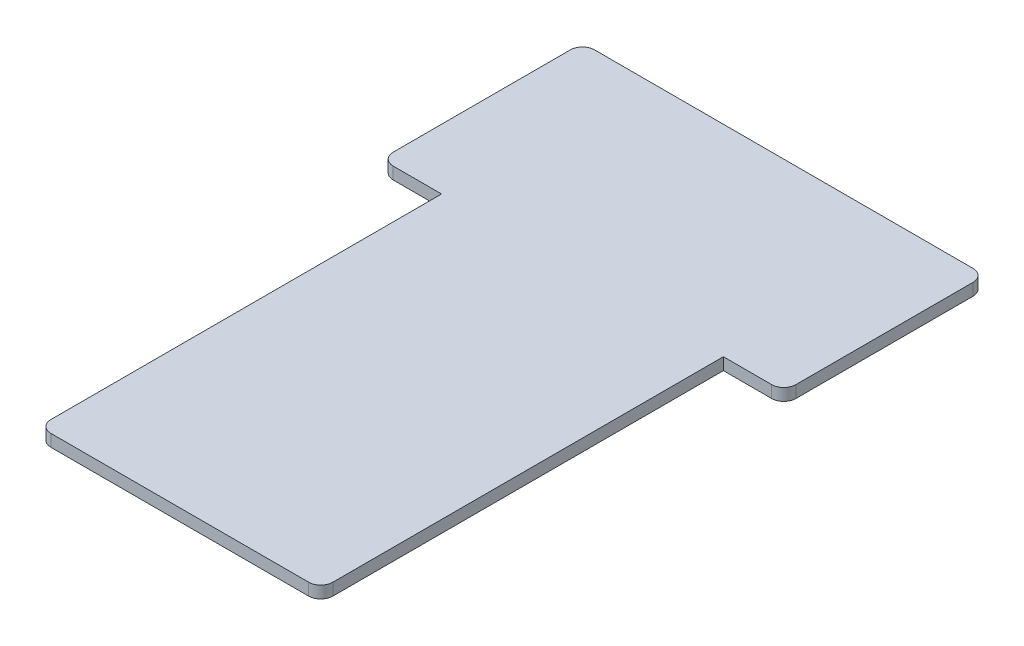
ISO-10303-21;
HEADER;
FILE_DESCRIPTION(('STEP AP214'),'2;1');
FILE_NAME('part.step','',(''),(''),'','','');
FILE_SCHEMA(('AUTOMOTIVE_DESIGN { 1 0 10303 214 1 1 1 1 }'));
ENDSEC;
DATA;
#1=APPLICATION_CONTEXT('core data for automotive mechanical design processes');
#2=APPLICATION_PROTOCOL_DEFINITION('international standard','automotive_design',2000,#1);
#3=PRODUCT_CONTEXT('',#1,'mechanical');
#4=PRODUCT('Part','Part','',(#3));
#5=PRODUCT_RELATED_PRODUCT_CATEGORY('part','',(#4));
#6=PRODUCT_DEFINITION_FORMATION('','',#4);
#7=PRODUCT_DEFINITION_CONTEXT('part definition',#1,'design');
#8=PRODUCT_DEFINITION('design','',#6,#7);
#9=PRODUCT_DEFINITION_SHAPE('','',#8);
#10=(LENGTH_UNIT() NAMED_UNIT(*) SI_UNIT(.MILLI.,.METRE.));
#11=(NAMED_UNIT(*) PLANE_ANGLE_UNIT() SI_UNIT($,.RADIAN.));
#12=(NAMED_UNIT(*) SI_UNIT($,.STERADIAN.) SOLID_ANGLE_UNIT());
#13=UNCERTAINTY_MEASURE_WITH_UNIT(LENGTH_MEASURE(1.E-05),#10,'distance_accuracy_value','');
#14=(GEOMETRIC_REPRESENTATION_CONTEXT(3) GLOBAL_UNCERTAINTY_ASSIGNED_CONTEXT((#13)) GLOBAL_UNIT_ASSIGNED_CONTEXT((#10,
#11,#12)) REPRESENTATION_CONTEXT('',''));
#15=CARTESIAN_POINT('',(0.,0.,0.));
#16=DIRECTION('',(0.,0.,1.));
#17=DIRECTION('',(1.,0.,0.));
#18=AXIS2_PLACEMENT_3D('',#15,#16,#17);
#19=CARTESIAN_POINT('',(-50.,3.,75.));
#20=DIRECTION('',(1.,0.,0.));
#21=DIRECTION('',(0.,0.,-1.));
#22=AXIS2_PLACEMENT_3D('',#19,#20,#21);
#23=PLANE('',#22);
#24=DIRECTION('',(0.,0.,1.));
#25=VECTOR('',#24,1.);
#26=CARTESIAN_POINT('',(-50.,0.,75.));
#27=LINE('',#26,#25);
#28=CARTESIAN_POINT('',(-50.,0.,-72.));
#29=VERTEX_POINT('',#28);
#30=CARTESIAN_POINT('',(-50.,0.,-28.));
#31=VERTEX_POINT('',#30);
#32=EDGE_CURVE('E207',#29,#31,#27,.T.);
#33=ORIENTED_EDGE('',*,*,#32,.T.);
#34=DIRECTION('',(0.,1.,0.));
#35=VECTOR('',#34,1.);
#36=CARTESIAN_POINT('',(-50.,3.,-28.));
#37=LINE('',#36,#35);
#38=CARTESIAN_POINT('',(-50.,3.,-28.));
#39=VERTEX_POINT('',#38);
#40=EDGE_CURVE('E48',#31,#39,#37,.T.);
#41=ORIENTED_EDGE('',*,*,#40,.T.);
#42=DIRECTION('',(0.,0.,1.));
#43=VECTOR('',#42,1.);
#44=CARTESIAN_POINT('',(-50.,3.,75.));
#45=LINE('',#44,#43);
#46=CARTESIAN_POINT('',(-50.,3.,-72.));
#47=VERTEX_POINT('',#46);
#48=EDGE_CURVE('E192',#47,#39,#45,.T.);
#49=ORIENTED_EDGE('',*,*,#48,.F.);
#50=DIRECTION('',(0.,-1.,0.));
#51=VECTOR('',#50,1.);
#52=CARTESIAN_POINT('',(-50.,3.,-72.));
#53=LINE('',#52,#51);
#54=EDGE_CURVE('E276',#47,#29,#53,.T.);
#55=ORIENTED_EDGE('',*,*,#54,.T.);
#56=EDGE_LOOP('',(#33,#41,#49,#55));
#57=FACE_BOUND('',#56,.T.);
#58=ADVANCED_FACE('F39',(#57),#23,.F.);
#59=CARTESIAN_POINT('',(-50.,3.,75.));
#60=DIRECTION('',(0.,0.,-1.));
#61=DIRECTION('',(-1.,0.,0.));
#62=AXIS2_PLACEMENT_3D('',#59,#60,#61);
#63=PLANE('',#62);
#64=DIRECTION('',(1.,0.,0.));
#65=VECTOR('',#64,1.);
#66=CARTESIAN_POINT('',(-50.,0.,75.));
#67=LINE('',#66,#65);
#68=CARTESIAN_POINT('',(-32.,0.,75.));
#69=VERTEX_POINT('',#68);
#70=CARTESIAN_POINT('',(32.,0.,75.));
#71=VERTEX_POINT('',#70);
#72=EDGE_CURVE('E188',#69,#71,#67,.T.);
#73=ORIENTED_EDGE('',*,*,#72,.T.);
#74=DIRECTION('',(0.,1.,0.));
#75=VECTOR('',#74,1.);
#76=CARTESIAN_POINT('',(32.,3.,75.));
#77=LINE('',#76,#75);
#78=CARTESIAN_POINT('',(32.,3.,75.));
#79=VERTEX_POINT('',#78);
#80=EDGE_CURVE('E216',#71,#79,#77,.T.);
#81=ORIENTED_EDGE('',*,*,#80,.T.);
#82=DIRECTION('',(1.,0.,0.));
#83=VECTOR('',#82,1.);
#84=CARTESIAN_POINT('',(-50.,3.,75.));
#85=LINE('',#84,#83);
#86=CARTESIAN_POINT('',(-32.,3.,75.));
#87=VERTEX_POINT('',#86);
#88=EDGE_CURVE('E196',#87,#79,#85,.T.);
#89=ORIENTED_EDGE('',*,*,#88,.F.);
#90=DIRECTION('',(0.,1.,0.));
#91=VECTOR('',#90,1.);
#92=CARTESIAN_POINT('',(-32.,3.,75.));
#93=LINE('',#92,#91);
#94=EDGE_CURVE('E200',#87,#69,#93,.F.);
#95=ORIENTED_EDGE('',*,*,#94,.T.);
#96=EDGE_LOOP('',(#73,#81,#89,#95));
#97=FACE_BOUND('',#96,.T.);
#98=ADVANCED_FACE('F315',(#97),#63,.F.);
#99=CARTESIAN_POINT('',(0.,3.,0.));
#100=DIRECTION('',(0.,-1.,0.));
#101=DIRECTION('',(0.,0.,-1.));
#102=AXIS2_PLACEMENT_3D('',#99,#100,#101);
#103=PLANE('',#102);
#104=ORIENTED_EDGE('',*,*,#88,.T.);
#105=CARTESIAN_POINT('',(32.,3.,72.));
#106=DIRECTION('',(0.,-1.,0.));
#107=DIRECTION('',(0.,0.,-1.));
#108=AXIS2_PLACEMENT_3D('',#105,#106,#107);
#109=CIRCLE('',#108,3.);
#110=CARTESIAN_POINT('',(35.,3.,72.));
#111=VERTEX_POINT('',#110);
#112=EDGE_CURVE('E235',#79,#111,#109,.F.);
#113=ORIENTED_EDGE('',*,*,#112,.T.);
#114=DIRECTION('',(0.,0.,1.));
#115=VECTOR('',#114,1.);
#116=CARTESIAN_POINT('',(35.,3.,0.));
#117=LINE('',#116,#115);
#118=CARTESIAN_POINT('',(35.,3.,-25.));
#119=VERTEX_POINT('',#118);
#120=EDGE_CURVE('E169',#119,#111,#117,.T.);
#121=ORIENTED_EDGE('',*,*,#120,.F.);
#122=DIRECTION('',(1.,0.,0.));
#123=VECTOR('',#122,1.);
#124=CARTESIAN_POINT('',(0.,3.,-25.));
#125=LINE('',#124,#123);
#126=CARTESIAN_POINT('',(47.,3.,-25.));
#127=VERTEX_POINT('',#126);
#128=EDGE_CURVE('E162',#119,#127,#125,.T.);
#129=ORIENTED_EDGE('',*,*,#128,.T.);
#130=CARTESIAN_POINT('',(47.,3.,-28.));
#131=DIRECTION('',(0.,-1.,0.));
#132=DIRECTION('',(0.,0.,-1.));
#133=AXIS2_PLACEMENT_3D('',#130,#131,#132);
#134=CIRCLE('',#133,3.);
#135=CARTESIAN_POINT('',(50.,3.,-28.));
#136=VERTEX_POINT('',#135);
#137=EDGE_CURVE('E229',#127,#136,#134,.F.);
#138=ORIENTED_EDGE('',*,*,#137,.T.);
#139=DIRECTION('',(0.,0.,-1.));
#140=VECTOR('',#139,1.);
#141=CARTESIAN_POINT('',(50.,3.,75.));
#142=LINE('',#141,#140);
#143=CARTESIAN_POINT('',(50.,3.,-72.));
#144=VERTEX_POINT('',#143);
#145=EDGE_CURVE('E183',#136,#144,#142,.T.);
#146=ORIENTED_EDGE('',*,*,#145,.T.);
#147=CARTESIAN_POINT('',(47.,3.,-72.));
#148=DIRECTION('',(0.,-1.,0.));
#149=DIRECTION('',(0.,0.,-1.));
#150=AXIS2_PLACEMENT_3D('',#147,#148,#149);
#151=CIRCLE('',#150,3.);
#152=CARTESIAN_POINT('',(47.,3.,-75.));
#153=VERTEX_POINT('',#152);
#154=EDGE_CURVE('E232',#144,#153,#151,.F.);
#155=ORIENTED_EDGE('',*,*,#154,.T.);
#156=DIRECTION('',(-1.,0.,0.));
#157=VECTOR('',#156,1.);
#158=CARTESIAN_POINT('',(-50.,3.,-75.));
#159=LINE('',#158,#157);
#160=CARTESIAN_POINT('',(-47.,3.,-75.));
#161=VERTEX_POINT('',#160);
#162=EDGE_CURVE('E187',#153,#161,#159,.T.);
#163=ORIENTED_EDGE('',*,*,#162,.T.);
#164=CARTESIAN_POINT('',(-47.,3.,-72.));
#165=DIRECTION('',(0.,-1.,0.));
#166=DIRECTION('',(0.,0.,-1.));
#167=AXIS2_PLACEMENT_3D('',#164,#165,#166);
#168=CIRCLE('',#167,3.);
#169=EDGE_CURVE('E220',#161,#47,#168,.F.);
#170=ORIENTED_EDGE('',*,*,#169,.T.);
#171=ORIENTED_EDGE('',*,*,#48,.T.);
#172=CARTESIAN_POINT('',(-47.,3.,-28.));
#173=DIRECTION('',(0.,-1.,0.));
#174=DIRECTION('',(0.,0.,-1.));
#175=AXIS2_PLACEMENT_3D('',#172,#173,#174);
#176=CIRCLE('',#175,3.);
#177=CARTESIAN_POINT('',(-47.,3.,-25.));
#178=VERTEX_POINT('',#177);
#179=EDGE_CURVE('E223',#39,#178,#176,.F.);
#180=ORIENTED_EDGE('',*,*,#179,.T.);
#181=DIRECTION('',(-1.,0.,0.));
#182=VECTOR('',#181,1.);
#183=CARTESIAN_POINT('',(0.,3.,-25.));
#184=LINE('',#183,#182);
#185=CARTESIAN_POINT('',(-35.,3.,-25.));
#186=VERTEX_POINT('',#185);
#187=EDGE_CURVE('E178',#186,#178,#184,.T.);
#188=ORIENTED_EDGE('',*,*,#187,.F.);
#189=DIRECTION('',(0.,0.,1.));
#190=VECTOR('',#189,1.);
#191=CARTESIAN_POINT('',(-35.,3.,0.));
#192=LINE('',#191,#190);
#193=CARTESIAN_POINT('',(-35.,3.,72.));
#194=VERTEX_POINT('',#193);
#195=EDGE_CURVE('E174',#186,#194,#192,.T.);
#196=ORIENTED_EDGE('',*,*,#195,.T.);
#197=CARTESIAN_POINT('',(-32.,3.,72.));
#198=DIRECTION('',(0.,-1.,0.));
#199=DIRECTION('',(0.,0.,-1.));
#200=AXIS2_PLACEMENT_3D('',#197,#198,#199);
#201=CIRCLE('',#200,3.);
#202=EDGE_CURVE('E226',#194,#87,#201,.F.);
#203=ORIENTED_EDGE('',*,*,#202,.T.);
#204=EDGE_LOOP('',(#104,#113,#121,#129,#138,#146,#155,#163,#170,#171,#180,#188,#196,#203));
#205=FACE_BOUND('',#204,.T.);
#206=ADVANCED_FACE('F289',(#205),#103,.F.);
#207=CARTESIAN_POINT('',(0.,0.,0.));
#208=DIRECTION('',(0.,-1.,0.));
#209=DIRECTION('',(0.,0.,-1.));
#210=AXIS2_PLACEMENT_3D('',#207,#208,#209);
#211=PLANE('',#210);
#212=DIRECTION('',(0.,0.,-1.));
#213=VECTOR('',#212,1.);
#214=CARTESIAN_POINT('',(35.,0.,75.));
#215=LINE('',#214,#213);
#216=CARTESIAN_POINT('',(35.,0.,72.));
#217=VERTEX_POINT('',#216);
#218=CARTESIAN_POINT('',(35.,0.,-25.));
#219=VERTEX_POINT('',#218);
#220=EDGE_CURVE('E141',#217,#219,#215,.T.);
#221=ORIENTED_EDGE('',*,*,#220,.F.);
#222=CARTESIAN_POINT('',(32.,0.,72.));
#223=DIRECTION('',(0.,-1.,0.));
#224=DIRECTION('',(0.,0.,-1.));
#225=AXIS2_PLACEMENT_3D('',#222,#223,#224);
#226=CIRCLE('',#225,3.);
#227=EDGE_CURVE('E253',#217,#71,#226,.T.);
#228=ORIENTED_EDGE('',*,*,#227,.T.);
#229=ORIENTED_EDGE('',*,*,#72,.F.);
#230=CARTESIAN_POINT('',(-32.,0.,72.));
#231=DIRECTION('',(0.,-1.,0.));
#232=DIRECTION('',(0.,0.,-1.));
#233=AXIS2_PLACEMENT_3D('',#230,#231,#232);
#234=CIRCLE('',#233,3.);
#235=CARTESIAN_POINT('',(-35.,0.,72.));
#236=VERTEX_POINT('',#235);
#237=EDGE_CURVE('E246',#69,#236,#234,.T.);
#238=ORIENTED_EDGE('',*,*,#237,.T.);
#239=DIRECTION('',(0.,0.,-1.));
#240=VECTOR('',#239,1.);
#241=CARTESIAN_POINT('',(-35.,0.,75.));
#242=LINE('',#241,#240);
#243=CARTESIAN_POINT('',(-35.,0.,-25.));
#244=VERTEX_POINT('',#243);
#245=EDGE_CURVE('E308',#236,#244,#242,.T.);
#246=ORIENTED_EDGE('',*,*,#245,.T.);
#247=DIRECTION('',(1.,0.,0.));
#248=VECTOR('',#247,1.);
#249=CARTESIAN_POINT('',(-50.,0.,-25.));
#250=LINE('',#249,#248);
#251=CARTESIAN_POINT('',(-47.,0.,-25.));
#252=VERTEX_POINT('',#251);
#253=EDGE_CURVE('E148',#252,#244,#250,.T.);
#254=ORIENTED_EDGE('',*,*,#253,.F.);
#255=CARTESIAN_POINT('',(-47.,0.,-28.));
#256=DIRECTION('',(0.,-1.,0.));
#257=DIRECTION('',(0.,0.,-1.));
#258=AXIS2_PLACEMENT_3D('',#255,#256,#257);
#259=CIRCLE('',#258,3.);
#260=EDGE_CURVE('E243',#252,#31,#259,.T.);
#261=ORIENTED_EDGE('',*,*,#260,.T.);
#262=ORIENTED_EDGE('',*,*,#32,.F.);
#263=CARTESIAN_POINT('',(-47.,0.,-72.));
#264=DIRECTION('',(0.,-1.,0.));
#265=DIRECTION('',(0.,0.,-1.));
#266=AXIS2_PLACEMENT_3D('',#263,#264,#265);
#267=CIRCLE('',#266,3.);
#268=CARTESIAN_POINT('',(-47.,0.,-75.));
#269=VERTEX_POINT('',#268);
#270=EDGE_CURVE('E240',#29,#269,#267,.T.);
#271=ORIENTED_EDGE('',*,*,#270,.T.);
#272=DIRECTION('',(-1.,0.,0.));
#273=VECTOR('',#272,1.);
#274=CARTESIAN_POINT('',(-50.,0.,-75.));
#275=LINE('',#274,#273);
#276=CARTESIAN_POINT('',(47.,0.,-75.));
#277=VERTEX_POINT('',#276);
#278=EDGE_CURVE('E203',#277,#269,#275,.T.);
#279=ORIENTED_EDGE('',*,*,#278,.F.);
#280=CARTESIAN_POINT('',(47.,0.,-72.));
#281=DIRECTION('',(0.,-1.,0.));
#282=DIRECTION('',(0.,0.,-1.));
#283=AXIS2_PLACEMENT_3D('',#280,#281,#282);
#284=CIRCLE('',#283,3.);
#285=CARTESIAN_POINT('',(50.,0.,-72.));
#286=VERTEX_POINT('',#285);
#287=EDGE_CURVE('E61',#277,#286,#284,.T.);
#288=ORIENTED_EDGE('',*,*,#287,.T.);
#289=DIRECTION('',(0.,0.,-1.));
#290=VECTOR('',#289,1.);
#291=CARTESIAN_POINT('',(50.,0.,75.));
#292=LINE('',#291,#290);
#293=CARTESIAN_POINT('',(50.,0.,-28.));
#294=VERTEX_POINT('',#293);
#295=EDGE_CURVE('E182',#294,#286,#292,.T.);
#296=ORIENTED_EDGE('',*,*,#295,.F.);
#297=CARTESIAN_POINT('',(47.,0.,-28.));
#298=DIRECTION('',(0.,-1.,0.));
#299=DIRECTION('',(0.,0.,-1.));
#300=AXIS2_PLACEMENT_3D('',#297,#298,#299);
#301=CIRCLE('',#300,3.);
#302=CARTESIAN_POINT('',(47.,0.,-25.));
#303=VERTEX_POINT('',#302);
#304=EDGE_CURVE('E55',#294,#303,#301,.T.);
#305=ORIENTED_EDGE('',*,*,#304,.T.);
#306=DIRECTION('',(-1.,0.,0.));
#307=VECTOR('',#306,1.);
#308=CARTESIAN_POINT('',(50.,0.,-25.));
#309=LINE('',#308,#307);
#310=EDGE_CURVE('E138',#303,#219,#309,.T.);
#311=ORIENTED_EDGE('',*,*,#310,.T.);
#312=EDGE_LOOP('',(#221,#228,#229,#238,#246,#254,#261,#262,#271,#279,#288,#296,#305,#311));
#313=FACE_BOUND('',#312,.T.);
#314=ADVANCED_FACE('F140',(#313),#211,.T.);
#315=CARTESIAN_POINT('',(50.,3.,75.));
#316=DIRECTION('',(-1.,0.,0.));
#317=DIRECTION('',(0.,0.,1.));
#318=AXIS2_PLACEMENT_3D('',#315,#316,#317);
#319=PLANE('',#318);
#320=ORIENTED_EDGE('',*,*,#295,.T.);
#321=DIRECTION('',(0.,-1.,0.));
#322=VECTOR('',#321,1.);
#323=CARTESIAN_POINT('',(50.,3.,-72.));
#324=LINE('',#323,#322);
#325=EDGE_CURVE('E266',#286,#144,#324,.F.);
#326=ORIENTED_EDGE('',*,*,#325,.T.);
#327=ORIENTED_EDGE('',*,*,#145,.F.);
#328=DIRECTION('',(0.,1.,0.));
#329=VECTOR('',#328,1.);
#330=CARTESIAN_POINT('',(50.,3.,-28.));
#331=LINE('',#330,#329);
#332=EDGE_CURVE('E263',#136,#294,#331,.F.);
#333=ORIENTED_EDGE('',*,*,#332,.T.);
#334=EDGE_LOOP('',(#320,#326,#327,#333));
#335=FACE_BOUND('',#334,.T.);
#336=ADVANCED_FACE('F324',(#335),#319,.F.);
#337=CARTESIAN_POINT('',(-50.,3.,-75.));
#338=DIRECTION('',(0.,0.,1.));
#339=DIRECTION('',(1.,0.,0.));
#340=AXIS2_PLACEMENT_3D('',#337,#338,#339);
#341=PLANE('',#340);
#342=ORIENTED_EDGE('',*,*,#162,.F.);
#343=DIRECTION('',(0.,-1.,0.));
#344=VECTOR('',#343,1.);
#345=CARTESIAN_POINT('',(47.,3.,-75.));
#346=LINE('',#345,#344);
#347=EDGE_CURVE('E259',#153,#277,#346,.T.);
#348=ORIENTED_EDGE('',*,*,#347,.T.);
#349=ORIENTED_EDGE('',*,*,#278,.T.);
#350=DIRECTION('',(0.,-1.,0.));
#351=VECTOR('',#350,1.);
#352=CARTESIAN_POINT('',(-47.,3.,-75.));
#353=LINE('',#352,#351);
#354=EDGE_CURVE('E256',#269,#161,#353,.F.);
#355=ORIENTED_EDGE('',*,*,#354,.T.);
#356=EDGE_LOOP('',(#342,#348,#349,#355));
#357=FACE_BOUND('',#356,.T.);
#358=ADVANCED_FACE('F345',(#357),#341,.F.);
#359=CARTESIAN_POINT('',(50.,0.,-25.));
#360=DIRECTION('',(0.,0.,-1.));
#361=DIRECTION('',(-1.,0.,0.));
#362=AXIS2_PLACEMENT_3D('',#359,#360,#361);
#363=PLANE('',#362);
#364=ORIENTED_EDGE('',*,*,#310,.F.);
#365=DIRECTION('',(0.,1.,0.));
#366=VECTOR('',#365,1.);
#367=CARTESIAN_POINT('',(47.,0.,-25.));
#368=LINE('',#367,#366);
#369=EDGE_CURVE('E269',#303,#127,#368,.T.);
#370=ORIENTED_EDGE('',*,*,#369,.T.);
#371=ORIENTED_EDGE('',*,*,#128,.F.);
#372=DIRECTION('',(0.,1.,0.));
#373=VECTOR('',#372,1.);
#374=CARTESIAN_POINT('',(35.,0.,-25.));
#375=LINE('',#374,#373);
#376=EDGE_CURVE('E154',#219,#119,#375,.T.);
#377=ORIENTED_EDGE('',*,*,#376,.F.);
#378=EDGE_LOOP('',(#364,#370,#371,#377));
#379=FACE_BOUND('',#378,.T.);
#380=ADVANCED_FACE('F160',(#379),#363,.F.);
#381=CARTESIAN_POINT('',(35.,0.,75.));
#382=DIRECTION('',(1.,0.,0.));
#383=DIRECTION('',(0.,0.,-1.));
#384=AXIS2_PLACEMENT_3D('',#381,#382,#383);
#385=PLANE('',#384);
#386=ORIENTED_EDGE('',*,*,#120,.T.);
#387=DIRECTION('',(0.,1.,0.));
#388=VECTOR('',#387,1.);
#389=CARTESIAN_POINT('',(35.,0.,72.));
#390=LINE('',#389,#388);
#391=EDGE_CURVE('E157',#111,#217,#390,.F.);
#392=ORIENTED_EDGE('',*,*,#391,.T.);
#393=ORIENTED_EDGE('',*,*,#220,.T.);
#394=ORIENTED_EDGE('',*,*,#376,.T.);
#395=EDGE_LOOP('',(#386,#392,#393,#394));
#396=FACE_BOUND('',#395,.T.);
#397=ADVANCED_FACE('F153',(#396),#385,.T.);
#398=CARTESIAN_POINT('',(-50.,0.,-25.));
#399=DIRECTION('',(0.,0.,1.));
#400=DIRECTION('',(1.,0.,0.));
#401=AXIS2_PLACEMENT_3D('',#398,#399,#400);
#402=PLANE('',#401);
#403=ORIENTED_EDGE('',*,*,#187,.T.);
#404=DIRECTION('',(0.,1.,0.));
#405=VECTOR('',#404,1.);
#406=CARTESIAN_POINT('',(-47.,0.,-25.));
#407=LINE('',#406,#405);
#408=EDGE_CURVE('E11',#178,#252,#407,.F.);
#409=ORIENTED_EDGE('',*,*,#408,.T.);
#410=ORIENTED_EDGE('',*,*,#253,.T.);
#411=DIRECTION('',(0.,1.,0.));
#412=VECTOR('',#411,1.);
#413=CARTESIAN_POINT('',(-35.,0.,-25.));
#414=LINE('',#413,#412);
#415=EDGE_CURVE('E166',#244,#186,#414,.T.);
#416=ORIENTED_EDGE('',*,*,#415,.T.);
#417=EDGE_LOOP('',(#403,#409,#410,#416));
#418=FACE_BOUND('',#417,.T.);
#419=ADVANCED_FACE('F300',(#418),#402,.T.);
#420=CARTESIAN_POINT('',(-35.,0.,75.));
#421=DIRECTION('',(1.,0.,0.));
#422=DIRECTION('',(0.,0.,-1.));
#423=AXIS2_PLACEMENT_3D('',#420,#421,#422);
#424=PLANE('',#423);
#425=ORIENTED_EDGE('',*,*,#245,.F.);
#426=DIRECTION('',(0.,1.,0.));
#427=VECTOR('',#426,1.);
#428=CARTESIAN_POINT('',(-35.,0.,72.));
#429=LINE('',#428,#427);
#430=EDGE_CURVE('E272',#236,#194,#429,.T.);
#431=ORIENTED_EDGE('',*,*,#430,.T.);
#432=ORIENTED_EDGE('',*,*,#195,.F.);
#433=ORIENTED_EDGE('',*,*,#415,.F.);
#434=EDGE_LOOP('',(#425,#431,#432,#433));
#435=FACE_BOUND('',#434,.T.);
#436=ADVANCED_FACE('F306',(#435),#424,.F.);
#437=CARTESIAN_POINT('',(32.,3.,72.));
#438=DIRECTION('',(0.,-1.,0.));
#439=DIRECTION('',(0.,0.,-1.));
#440=AXIS2_PLACEMENT_3D('',#437,#438,#439);
#441=CYLINDRICAL_SURFACE('',#440,3.);
#442=ORIENTED_EDGE('',*,*,#227,.F.);
#443=ORIENTED_EDGE('',*,*,#391,.F.);
#444=ORIENTED_EDGE('',*,*,#112,.F.);
#445=ORIENTED_EDGE('',*,*,#80,.F.);
#446=EDGE_LOOP('',(#442,#443,#444,#445));
#447=FACE_BOUND('',#446,.T.);
#448=ADVANCED_FACE('F318',(#447),#441,.T.);
#449=CARTESIAN_POINT('',(47.,3.,-72.));
#450=DIRECTION('',(0.,-1.,0.));
#451=DIRECTION('',(0.,0.,-1.));
#452=AXIS2_PLACEMENT_3D('',#449,#450,#451);
#453=CYLINDRICAL_SURFACE('',#452,3.);
#454=ORIENTED_EDGE('',*,*,#154,.F.);
#455=ORIENTED_EDGE('',*,*,#325,.F.);
#456=ORIENTED_EDGE('',*,*,#287,.F.);
#457=ORIENTED_EDGE('',*,*,#347,.F.);
#458=EDGE_LOOP('',(#454,#455,#456,#457));
#459=FACE_BOUND('',#458,.T.);
#460=ADVANCED_FACE('F328',(#459),#453,.T.);
#461=CARTESIAN_POINT('',(47.,0.,-28.));
#462=DIRECTION('',(0.,1.,0.));
#463=DIRECTION('',(0.,0.,1.));
#464=AXIS2_PLACEMENT_3D('',#461,#462,#463);
#465=CYLINDRICAL_SURFACE('',#464,3.);
#466=ORIENTED_EDGE('',*,*,#304,.F.);
#467=ORIENTED_EDGE('',*,*,#332,.F.);
#468=ORIENTED_EDGE('',*,*,#137,.F.);
#469=ORIENTED_EDGE('',*,*,#369,.F.);
#470=EDGE_LOOP('',(#466,#467,#468,#469));
#471=FACE_BOUND('',#470,.T.);
#472=ADVANCED_FACE('F326',(#471),#465,.T.);
#473=CARTESIAN_POINT('',(-32.,0.,72.));
#474=DIRECTION('',(0.,1.,0.));
#475=DIRECTION('',(0.,0.,1.));
#476=AXIS2_PLACEMENT_3D('',#473,#474,#475);
#477=CYLINDRICAL_SURFACE('',#476,3.);
#478=ORIENTED_EDGE('',*,*,#237,.F.);
#479=ORIENTED_EDGE('',*,*,#94,.F.);
#480=ORIENTED_EDGE('',*,*,#202,.F.);
#481=ORIENTED_EDGE('',*,*,#430,.F.);
#482=EDGE_LOOP('',(#478,#479,#480,#481));
#483=FACE_BOUND('',#482,.T.);
#484=ADVANCED_FACE('F311',(#483),#477,.T.);
#485=CARTESIAN_POINT('',(-47.,3.,-28.));
#486=DIRECTION('',(0.,-1.,0.));
#487=DIRECTION('',(0.,0.,-1.));
#488=AXIS2_PLACEMENT_3D('',#485,#486,#487);
#489=CYLINDRICAL_SURFACE('',#488,3.);
#490=ORIENTED_EDGE('',*,*,#260,.F.);
#491=ORIENTED_EDGE('',*,*,#408,.F.);
#492=ORIENTED_EDGE('',*,*,#179,.F.);
#493=ORIENTED_EDGE('',*,*,#40,.F.);
#494=EDGE_LOOP('',(#490,#491,#492,#493));
#495=FACE_BOUND('',#494,.T.);
#496=ADVANCED_FACE('F298',(#495),#489,.T.);
#497=CARTESIAN_POINT('',(-47.,3.,-72.));
#498=DIRECTION('',(0.,-1.,0.));
#499=DIRECTION('',(0.,0.,-1.));
#500=AXIS2_PLACEMENT_3D('',#497,#498,#499);
#501=CYLINDRICAL_SURFACE('',#500,3.);
#502=ORIENTED_EDGE('',*,*,#169,.F.);
#503=ORIENTED_EDGE('',*,*,#354,.F.);
#504=ORIENTED_EDGE('',*,*,#270,.F.);
#505=ORIENTED_EDGE('',*,*,#54,.F.);
#506=EDGE_LOOP('',(#502,#503,#504,#505));
#507=FACE_BOUND('',#506,.T.);
#508=ADVANCED_FACE('F41',(#507),#501,.T.);
#509=CLOSED_SHELL('',(#58,#98,#206,#314,#336,#358,#380,#397,#419,#436,#448,#460,#472,#484,#496,#508));
#510=MANIFOLD_SOLID_BREP('B2',#509);
#511=ADVANCED_BREP_SHAPE_REPRESENTATION('',(#18,#510),#14);
#512=SHAPE_DEFINITION_REPRESENTATION(#9,#511);
ENDSEC;
END-ISO-10303-21;
